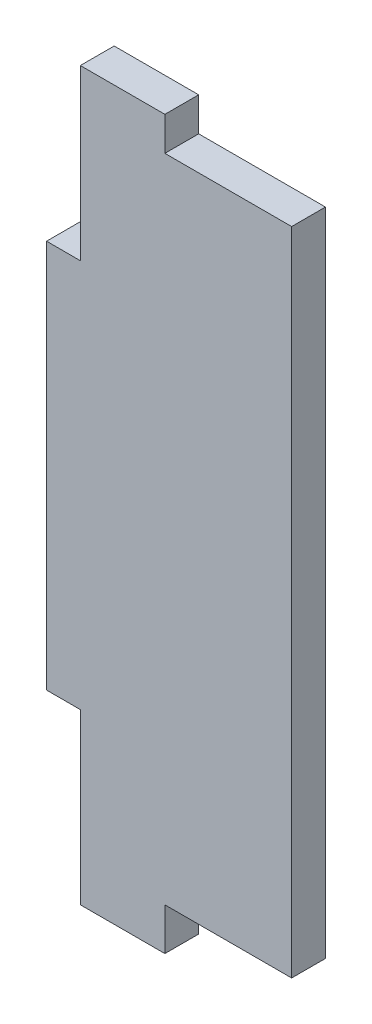
ISO-10303-21;
HEADER;
FILE_DESCRIPTION(('STEP AP214'),'2;1');
FILE_NAME('part.step','',(''),(''),'','','');
FILE_SCHEMA(('AUTOMOTIVE_DESIGN { 1 0 10303 214 1 1 1 1 }'));
ENDSEC;
DATA;
#1=APPLICATION_CONTEXT('core data for automotive mechanical design processes');
#2=APPLICATION_PROTOCOL_DEFINITION('international standard','automotive_design',2000,#1);
#3=PRODUCT_CONTEXT('',#1,'mechanical');
#4=PRODUCT('Part','Part','',(#3));
#5=PRODUCT_RELATED_PRODUCT_CATEGORY('part','',(#4));
#6=PRODUCT_DEFINITION_FORMATION('','',#4);
#7=PRODUCT_DEFINITION_CONTEXT('part definition',#1,'design');
#8=PRODUCT_DEFINITION('design','',#6,#7);
#9=PRODUCT_DEFINITION_SHAPE('','',#8);
#10=(LENGTH_UNIT() NAMED_UNIT(*) SI_UNIT(.MILLI.,.METRE.));
#11=(NAMED_UNIT(*) PLANE_ANGLE_UNIT() SI_UNIT($,.RADIAN.));
#12=(NAMED_UNIT(*) SI_UNIT($,.STERADIAN.) SOLID_ANGLE_UNIT());
#13=UNCERTAINTY_MEASURE_WITH_UNIT(LENGTH_MEASURE(1.E-05),#10,'distance_accuracy_value','');
#14=(GEOMETRIC_REPRESENTATION_CONTEXT(3) GLOBAL_UNCERTAINTY_ASSIGNED_CONTEXT((#13)) GLOBAL_UNIT_ASSIGNED_CONTEXT((#10,
#11,#12)) REPRESENTATION_CONTEXT('',''));
#15=CARTESIAN_POINT('',(0.,0.,0.));
#16=DIRECTION('',(0.,0.,1.));
#17=DIRECTION('',(1.,0.,0.));
#18=AXIS2_PLACEMENT_3D('',#15,#16,#17);
#19=CARTESIAN_POINT('',(0.,0.,4.));
#20=DIRECTION('',(1.,0.,0.));
#21=DIRECTION('',(0.,1.,0.));
#22=AXIS2_PLACEMENT_3D('',#19,#20,#21);
#23=PLANE('',#22);
#24=DIRECTION('',(0.,-1.,0.));
#25=VECTOR('',#24,1.);
#26=CARTESIAN_POINT('',(0.,0.,0.));
#27=LINE('',#26,#25);
#28=CARTESIAN_POINT('',(0.,20.,0.));
#29=VERTEX_POINT('',#28);
#30=CARTESIAN_POINT('',(0.,0.,0.));
#31=VERTEX_POINT('',#30);
#32=EDGE_CURVE('E152',#29,#31,#27,.T.);
#33=ORIENTED_EDGE('',*,*,#32,.T.);
#34=DIRECTION('',(0.,0.,-1.));
#35=VECTOR('',#34,1.);
#36=CARTESIAN_POINT('',(0.,0.,4.));
#37=LINE('',#36,#35);
#38=CARTESIAN_POINT('',(0.,0.,4.));
#39=VERTEX_POINT('',#38);
#40=EDGE_CURVE('E11',#39,#31,#37,.T.);
#41=ORIENTED_EDGE('',*,*,#40,.F.);
#42=DIRECTION('',(0.,-1.,0.));
#43=VECTOR('',#42,1.);
#44=CARTESIAN_POINT('',(0.,0.,4.));
#45=LINE('',#44,#43);
#46=CARTESIAN_POINT('',(0.,20.,4.));
#47=VERTEX_POINT('',#46);
#48=EDGE_CURVE('E174',#47,#39,#45,.T.);
#49=ORIENTED_EDGE('',*,*,#48,.F.);
#50=DIRECTION('',(0.,0.,-1.));
#51=VECTOR('',#50,1.);
#52=CARTESIAN_POINT('',(0.,20.,4.));
#53=LINE('',#52,#51);
#54=EDGE_CURVE('E148',#47,#29,#53,.T.);
#55=ORIENTED_EDGE('',*,*,#54,.T.);
#56=EDGE_LOOP('',(#33,#41,#49,#55));
#57=FACE_BOUND('',#56,.T.);
#58=ADVANCED_FACE('F32',(#57),#23,.F.);
#59=CARTESIAN_POINT('',(0.,0.,4.));
#60=DIRECTION('',(0.,1.,0.));
#61=DIRECTION('',(0.,0.,1.));
#62=AXIS2_PLACEMENT_3D('',#59,#60,#61);
#63=PLANE('',#62);
#64=DIRECTION('',(1.,0.,0.));
#65=VECTOR('',#64,1.);
#66=CARTESIAN_POINT('',(0.,0.,0.));
#67=LINE('',#66,#65);
#68=CARTESIAN_POINT('',(10.,0.,0.));
#69=VERTEX_POINT('',#68);
#70=EDGE_CURVE('E155',#31,#69,#67,.T.);
#71=ORIENTED_EDGE('',*,*,#70,.T.);
#72=DIRECTION('',(0.,0.,-1.));
#73=VECTOR('',#72,1.);
#74=CARTESIAN_POINT('',(10.,0.,4.));
#75=LINE('',#74,#73);
#76=CARTESIAN_POINT('',(10.,0.,4.));
#77=VERTEX_POINT('',#76);
#78=EDGE_CURVE('E40',#77,#69,#75,.T.);
#79=ORIENTED_EDGE('',*,*,#78,.F.);
#80=DIRECTION('',(1.,0.,0.));
#81=VECTOR('',#80,1.);
#82=CARTESIAN_POINT('',(0.,0.,4.));
#83=LINE('',#82,#81);
#84=EDGE_CURVE('E103',#39,#77,#83,.T.);
#85=ORIENTED_EDGE('',*,*,#84,.F.);
#86=ORIENTED_EDGE('',*,*,#40,.T.);
#87=EDGE_LOOP('',(#71,#79,#85,#86));
#88=FACE_BOUND('',#87,.T.);
#89=ADVANCED_FACE('F252',(#88),#63,.F.);
#90=CARTESIAN_POINT('',(10.,0.,4.));
#91=DIRECTION('',(-1.,0.,0.));
#92=DIRECTION('',(0.,0.,1.));
#93=AXIS2_PLACEMENT_3D('',#90,#91,#92);
#94=PLANE('',#93);
#95=DIRECTION('',(0.,1.,0.));
#96=VECTOR('',#95,1.);
#97=CARTESIAN_POINT('',(10.,0.,0.));
#98=LINE('',#97,#96);
#99=CARTESIAN_POINT('',(10.,5.,0.));
#100=VERTEX_POINT('',#99);
#101=EDGE_CURVE('E157',#69,#100,#98,.T.);
#102=ORIENTED_EDGE('',*,*,#101,.T.);
#103=DIRECTION('',(0.,0.,-1.));
#104=VECTOR('',#103,1.);
#105=CARTESIAN_POINT('',(10.,5.,4.));
#106=LINE('',#105,#104);
#107=CARTESIAN_POINT('',(10.,5.,4.));
#108=VERTEX_POINT('',#107);
#109=EDGE_CURVE('E193',#108,#100,#106,.T.);
#110=ORIENTED_EDGE('',*,*,#109,.F.);
#111=DIRECTION('',(0.,1.,0.));
#112=VECTOR('',#111,1.);
#113=CARTESIAN_POINT('',(10.,0.,4.));
#114=LINE('',#113,#112);
#115=EDGE_CURVE('E201',#77,#108,#114,.T.);
#116=ORIENTED_EDGE('',*,*,#115,.F.);
#117=ORIENTED_EDGE('',*,*,#78,.T.);
#118=EDGE_LOOP('',(#102,#110,#116,#117));
#119=FACE_BOUND('',#118,.T.);
#120=ADVANCED_FACE('F199',(#119),#94,.F.);
#121=CARTESIAN_POINT('',(10.,5.,4.));
#122=DIRECTION('',(0.,1.,0.));
#123=DIRECTION('',(0.,0.,1.));
#124=AXIS2_PLACEMENT_3D('',#121,#122,#123);
#125=PLANE('',#124);
#126=DIRECTION('',(1.,0.,0.));
#127=VECTOR('',#126,1.);
#128=CARTESIAN_POINT('',(10.,5.,0.));
#129=LINE('',#128,#127);
#130=CARTESIAN_POINT('',(25.,5.,0.));
#131=VERTEX_POINT('',#130);
#132=EDGE_CURVE('E159',#100,#131,#129,.T.);
#133=ORIENTED_EDGE('',*,*,#132,.T.);
#134=DIRECTION('',(0.,0.,-1.));
#135=VECTOR('',#134,1.);
#136=CARTESIAN_POINT('',(25.,5.,4.));
#137=LINE('',#136,#135);
#138=CARTESIAN_POINT('',(25.,5.,4.));
#139=VERTEX_POINT('',#138);
#140=EDGE_CURVE('E190',#139,#131,#137,.T.);
#141=ORIENTED_EDGE('',*,*,#140,.F.);
#142=DIRECTION('',(1.,0.,0.));
#143=VECTOR('',#142,1.);
#144=CARTESIAN_POINT('',(10.,5.,4.));
#145=LINE('',#144,#143);
#146=EDGE_CURVE('E219',#108,#139,#145,.T.);
#147=ORIENTED_EDGE('',*,*,#146,.F.);
#148=ORIENTED_EDGE('',*,*,#109,.T.);
#149=EDGE_LOOP('',(#133,#141,#147,#148));
#150=FACE_BOUND('',#149,.T.);
#151=ADVANCED_FACE('F210',(#150),#125,.F.);
#152=CARTESIAN_POINT('',(25.,5.,4.));
#153=DIRECTION('',(-1.,0.,0.));
#154=DIRECTION('',(0.,0.,1.));
#155=AXIS2_PLACEMENT_3D('',#152,#153,#154);
#156=PLANE('',#155);
#157=DIRECTION('',(0.,1.,0.));
#158=VECTOR('',#157,1.);
#159=CARTESIAN_POINT('',(25.,5.,0.));
#160=LINE('',#159,#158);
#161=CARTESIAN_POINT('',(25.,82.,0.));
#162=VERTEX_POINT('',#161);
#163=EDGE_CURVE('E161',#131,#162,#160,.T.);
#164=ORIENTED_EDGE('',*,*,#163,.T.);
#165=DIRECTION('',(0.,0.,-1.));
#166=VECTOR('',#165,1.);
#167=CARTESIAN_POINT('',(25.,82.,4.));
#168=LINE('',#167,#166);
#169=CARTESIAN_POINT('',(25.,82.,4.));
#170=VERTEX_POINT('',#169);
#171=EDGE_CURVE('E187',#170,#162,#168,.T.);
#172=ORIENTED_EDGE('',*,*,#171,.F.);
#173=DIRECTION('',(0.,1.,0.));
#174=VECTOR('',#173,1.);
#175=CARTESIAN_POINT('',(25.,5.,4.));
#176=LINE('',#175,#174);
#177=EDGE_CURVE('E216',#139,#170,#176,.T.);
#178=ORIENTED_EDGE('',*,*,#177,.F.);
#179=ORIENTED_EDGE('',*,*,#140,.T.);
#180=EDGE_LOOP('',(#164,#172,#178,#179));
#181=FACE_BOUND('',#180,.T.);
#182=ADVANCED_FACE('F214',(#181),#156,.F.);
#183=CARTESIAN_POINT('',(10.,82.,4.));
#184=DIRECTION('',(0.,-1.,0.));
#185=DIRECTION('',(0.,0.,-1.));
#186=AXIS2_PLACEMENT_3D('',#183,#184,#185);
#187=PLANE('',#186);
#188=DIRECTION('',(-1.,0.,0.));
#189=VECTOR('',#188,1.);
#190=CARTESIAN_POINT('',(10.,82.,0.));
#191=LINE('',#190,#189);
#192=CARTESIAN_POINT('',(10.,82.,0.));
#193=VERTEX_POINT('',#192);
#194=EDGE_CURVE('E163',#162,#193,#191,.T.);
#195=ORIENTED_EDGE('',*,*,#194,.T.);
#196=DIRECTION('',(0.,0.,-1.));
#197=VECTOR('',#196,1.);
#198=CARTESIAN_POINT('',(10.,82.,4.));
#199=LINE('',#198,#197);
#200=CARTESIAN_POINT('',(10.,82.,4.));
#201=VERTEX_POINT('',#200);
#202=EDGE_CURVE('E184',#201,#193,#199,.T.);
#203=ORIENTED_EDGE('',*,*,#202,.F.);
#204=DIRECTION('',(-1.,0.,0.));
#205=VECTOR('',#204,1.);
#206=CARTESIAN_POINT('',(10.,82.,4.));
#207=LINE('',#206,#205);
#208=EDGE_CURVE('E218',#170,#201,#207,.T.);
#209=ORIENTED_EDGE('',*,*,#208,.F.);
#210=ORIENTED_EDGE('',*,*,#171,.T.);
#211=EDGE_LOOP('',(#195,#203,#209,#210));
#212=FACE_BOUND('',#211,.T.);
#213=ADVANCED_FACE('F265',(#212),#187,.F.);
#214=CARTESIAN_POINT('',(10.,86.,4.));
#215=DIRECTION('',(-1.,0.,0.));
#216=DIRECTION('',(0.,0.,1.));
#217=AXIS2_PLACEMENT_3D('',#214,#215,#216);
#218=PLANE('',#217);
#219=DIRECTION('',(0.,1.,0.));
#220=VECTOR('',#219,1.);
#221=CARTESIAN_POINT('',(10.,86.,0.));
#222=LINE('',#221,#220);
#223=CARTESIAN_POINT('',(10.,86.,0.));
#224=VERTEX_POINT('',#223);
#225=EDGE_CURVE('E165',#193,#224,#222,.T.);
#226=ORIENTED_EDGE('',*,*,#225,.T.);
#227=DIRECTION('',(0.,0.,-1.));
#228=VECTOR('',#227,1.);
#229=CARTESIAN_POINT('',(10.,86.,4.));
#230=LINE('',#229,#228);
#231=CARTESIAN_POINT('',(10.,86.,4.));
#232=VERTEX_POINT('',#231);
#233=EDGE_CURVE('E181',#232,#224,#230,.T.);
#234=ORIENTED_EDGE('',*,*,#233,.F.);
#235=DIRECTION('',(0.,1.,0.));
#236=VECTOR('',#235,1.);
#237=CARTESIAN_POINT('',(10.,86.,4.));
#238=LINE('',#237,#236);
#239=EDGE_CURVE('E221',#201,#232,#238,.T.);
#240=ORIENTED_EDGE('',*,*,#239,.F.);
#241=ORIENTED_EDGE('',*,*,#202,.T.);
#242=EDGE_LOOP('',(#226,#234,#240,#241));
#243=FACE_BOUND('',#242,.T.);
#244=ADVANCED_FACE('F268',(#243),#218,.F.);
#245=CARTESIAN_POINT('',(0.,86.,4.));
#246=DIRECTION('',(0.,-1.,0.));
#247=DIRECTION('',(0.,0.,-1.));
#248=AXIS2_PLACEMENT_3D('',#245,#246,#247);
#249=PLANE('',#248);
#250=DIRECTION('',(-1.,0.,0.));
#251=VECTOR('',#250,1.);
#252=CARTESIAN_POINT('',(0.,86.,0.));
#253=LINE('',#252,#251);
#254=CARTESIAN_POINT('',(0.,86.,0.));
#255=VERTEX_POINT('',#254);
#256=EDGE_CURVE('E167',#224,#255,#253,.T.);
#257=ORIENTED_EDGE('',*,*,#256,.T.);
#258=DIRECTION('',(0.,0.,-1.));
#259=VECTOR('',#258,1.);
#260=CARTESIAN_POINT('',(0.,86.,4.));
#261=LINE('',#260,#259);
#262=CARTESIAN_POINT('',(0.,86.,4.));
#263=VERTEX_POINT('',#262);
#264=EDGE_CURVE('E178',#263,#255,#261,.T.);
#265=ORIENTED_EDGE('',*,*,#264,.F.);
#266=DIRECTION('',(-1.,0.,0.));
#267=VECTOR('',#266,1.);
#268=CARTESIAN_POINT('',(0.,86.,4.));
#269=LINE('',#268,#267);
#270=EDGE_CURVE('E227',#232,#263,#269,.T.);
#271=ORIENTED_EDGE('',*,*,#270,.F.);
#272=ORIENTED_EDGE('',*,*,#233,.T.);
#273=EDGE_LOOP('',(#257,#265,#271,#272));
#274=FACE_BOUND('',#273,.T.);
#275=ADVANCED_FACE('F233',(#274),#249,.F.);
#276=CARTESIAN_POINT('',(0.,66.,4.));
#277=DIRECTION('',(1.,0.,0.));
#278=DIRECTION('',(0.,0.,-1.));
#279=AXIS2_PLACEMENT_3D('',#276,#277,#278);
#280=PLANE('',#279);
#281=DIRECTION('',(0.,-1.,0.));
#282=VECTOR('',#281,1.);
#283=CARTESIAN_POINT('',(0.,66.,0.));
#284=LINE('',#283,#282);
#285=CARTESIAN_POINT('',(0.,66.,0.));
#286=VERTEX_POINT('',#285);
#287=EDGE_CURVE('E169',#255,#286,#284,.T.);
#288=ORIENTED_EDGE('',*,*,#287,.T.);
#289=DIRECTION('',(0.,0.,-1.));
#290=VECTOR('',#289,1.);
#291=CARTESIAN_POINT('',(0.,66.,4.));
#292=LINE('',#291,#290);
#293=CARTESIAN_POINT('',(0.,66.,4.));
#294=VERTEX_POINT('',#293);
#295=EDGE_CURVE('E143',#294,#286,#292,.T.);
#296=ORIENTED_EDGE('',*,*,#295,.F.);
#297=DIRECTION('',(0.,-1.,0.));
#298=VECTOR('',#297,1.);
#299=CARTESIAN_POINT('',(0.,66.,4.));
#300=LINE('',#299,#298);
#301=EDGE_CURVE('E134',#263,#294,#300,.T.);
#302=ORIENTED_EDGE('',*,*,#301,.F.);
#303=ORIENTED_EDGE('',*,*,#264,.T.);
#304=EDGE_LOOP('',(#288,#296,#302,#303));
#305=FACE_BOUND('',#304,.T.);
#306=ADVANCED_FACE('F237',(#305),#280,.F.);
#307=CARTESIAN_POINT('',(0.,66.,4.));
#308=DIRECTION('',(0.,-1.,0.));
#309=DIRECTION('',(0.,0.,-1.));
#310=AXIS2_PLACEMENT_3D('',#307,#308,#309);
#311=PLANE('',#310);
#312=DIRECTION('',(-1.,0.,0.));
#313=VECTOR('',#312,1.);
#314=CARTESIAN_POINT('',(0.,66.,0.));
#315=LINE('',#314,#313);
#316=CARTESIAN_POINT('',(-4.,66.,0.));
#317=VERTEX_POINT('',#316);
#318=EDGE_CURVE('E142',#286,#317,#315,.T.);
#319=ORIENTED_EDGE('',*,*,#318,.T.);
#320=DIRECTION('',(0.,0.,-1.));
#321=VECTOR('',#320,1.);
#322=CARTESIAN_POINT('',(-4.,66.,4.));
#323=LINE('',#322,#321);
#324=CARTESIAN_POINT('',(-4.,66.,4.));
#325=VERTEX_POINT('',#324);
#326=EDGE_CURVE('E139',#325,#317,#323,.T.);
#327=ORIENTED_EDGE('',*,*,#326,.F.);
#328=DIRECTION('',(-1.,0.,0.));
#329=VECTOR('',#328,1.);
#330=CARTESIAN_POINT('',(0.,66.,4.));
#331=LINE('',#330,#329);
#332=EDGE_CURVE('E128',#294,#325,#331,.T.);
#333=ORIENTED_EDGE('',*,*,#332,.F.);
#334=ORIENTED_EDGE('',*,*,#295,.T.);
#335=EDGE_LOOP('',(#319,#327,#333,#334));
#336=FACE_BOUND('',#335,.T.);
#337=ADVANCED_FACE('F140',(#336),#311,.F.);
#338=CARTESIAN_POINT('',(-4.,66.,4.));
#339=DIRECTION('',(1.,0.,0.));
#340=DIRECTION('',(0.,1.,0.));
#341=AXIS2_PLACEMENT_3D('',#338,#339,#340);
#342=PLANE('',#341);
#343=DIRECTION('',(0.,-1.,0.));
#344=VECTOR('',#343,1.);
#345=CARTESIAN_POINT('',(-4.,66.,0.));
#346=LINE('',#345,#344);
#347=CARTESIAN_POINT('',(-4.00000000000001,20.,0.));
#348=VERTEX_POINT('',#347);
#349=EDGE_CURVE('E89',#317,#348,#346,.T.);
#350=ORIENTED_EDGE('',*,*,#349,.T.);
#351=DIRECTION('',(0.,0.,-1.));
#352=VECTOR('',#351,1.);
#353=CARTESIAN_POINT('',(-4.00000000000001,20.,4.));
#354=LINE('',#353,#352);
#355=CARTESIAN_POINT('',(-4.00000000000001,20.,4.));
#356=VERTEX_POINT('',#355);
#357=EDGE_CURVE('E144',#356,#348,#354,.T.);
#358=ORIENTED_EDGE('',*,*,#357,.F.);
#359=DIRECTION('',(0.,-1.,0.));
#360=VECTOR('',#359,1.);
#361=CARTESIAN_POINT('',(-4.,66.,4.));
#362=LINE('',#361,#360);
#363=EDGE_CURVE('E132',#325,#356,#362,.T.);
#364=ORIENTED_EDGE('',*,*,#363,.F.);
#365=ORIENTED_EDGE('',*,*,#326,.T.);
#366=EDGE_LOOP('',(#350,#358,#364,#365));
#367=FACE_BOUND('',#366,.T.);
#368=ADVANCED_FACE('F146',(#367),#342,.F.);
#369=CARTESIAN_POINT('',(0.,20.,4.));
#370=DIRECTION('',(0.,1.,0.));
#371=DIRECTION('',(0.,0.,1.));
#372=AXIS2_PLACEMENT_3D('',#369,#370,#371);
#373=PLANE('',#372);
#374=DIRECTION('',(1.,0.,0.));
#375=VECTOR('',#374,1.);
#376=CARTESIAN_POINT('',(0.,20.,0.));
#377=LINE('',#376,#375);
#378=EDGE_CURVE('E95',#348,#29,#377,.T.);
#379=ORIENTED_EDGE('',*,*,#378,.T.);
#380=ORIENTED_EDGE('',*,*,#54,.F.);
#381=DIRECTION('',(1.,0.,0.));
#382=VECTOR('',#381,1.);
#383=CARTESIAN_POINT('',(0.,20.,4.));
#384=LINE('',#383,#382);
#385=EDGE_CURVE('E48',#356,#47,#384,.T.);
#386=ORIENTED_EDGE('',*,*,#385,.F.);
#387=ORIENTED_EDGE('',*,*,#357,.T.);
#388=EDGE_LOOP('',(#379,#380,#386,#387));
#389=FACE_BOUND('',#388,.T.);
#390=ADVANCED_FACE('F241',(#389),#373,.F.);
#391=CARTESIAN_POINT('',(0.,0.,4.));
#392=DIRECTION('',(0.,0.,1.));
#393=DIRECTION('',(1.,0.,0.));
#394=AXIS2_PLACEMENT_3D('',#391,#392,#393);
#395=PLANE('',#394);
#396=ORIENTED_EDGE('',*,*,#48,.T.);
#397=ORIENTED_EDGE('',*,*,#84,.T.);
#398=ORIENTED_EDGE('',*,*,#115,.T.);
#399=ORIENTED_EDGE('',*,*,#146,.T.);
#400=ORIENTED_EDGE('',*,*,#177,.T.);
#401=ORIENTED_EDGE('',*,*,#208,.T.);
#402=ORIENTED_EDGE('',*,*,#239,.T.);
#403=ORIENTED_EDGE('',*,*,#270,.T.);
#404=ORIENTED_EDGE('',*,*,#301,.T.);
#405=ORIENTED_EDGE('',*,*,#332,.T.);
#406=ORIENTED_EDGE('',*,*,#363,.T.);
#407=ORIENTED_EDGE('',*,*,#385,.T.);
#408=EDGE_LOOP('',(#396,#397,#398,#399,#400,#401,#402,#403,#404,#405,#406,#407));
#409=FACE_BOUND('',#408,.T.);
#410=ADVANCED_FACE('F130',(#409),#395,.T.);
#411=CARTESIAN_POINT('',(0.,0.,0.));
#412=DIRECTION('',(0.,0.,1.));
#413=DIRECTION('',(1.,0.,0.));
#414=AXIS2_PLACEMENT_3D('',#411,#412,#413);
#415=PLANE('',#414);
#416=ORIENTED_EDGE('',*,*,#32,.F.);
#417=ORIENTED_EDGE('',*,*,#378,.F.);
#418=ORIENTED_EDGE('',*,*,#349,.F.);
#419=ORIENTED_EDGE('',*,*,#318,.F.);
#420=ORIENTED_EDGE('',*,*,#287,.F.);
#421=ORIENTED_EDGE('',*,*,#256,.F.);
#422=ORIENTED_EDGE('',*,*,#225,.F.);
#423=ORIENTED_EDGE('',*,*,#194,.F.);
#424=ORIENTED_EDGE('',*,*,#163,.F.);
#425=ORIENTED_EDGE('',*,*,#132,.F.);
#426=ORIENTED_EDGE('',*,*,#101,.F.);
#427=ORIENTED_EDGE('',*,*,#70,.F.);
#428=EDGE_LOOP('',(#416,#417,#418,#419,#420,#421,#422,#423,#424,#425,#426,#427));
#429=FACE_BOUND('',#428,.T.);
#430=ADVANCED_FACE('F205',(#429),#415,.F.);
#431=CLOSED_SHELL('',(#58,#89,#120,#151,#182,#213,#244,#275,#306,#337,#368,#390,#410,#430));
#432=MANIFOLD_SOLID_BREP('B2',#431);
#433=ADVANCED_BREP_SHAPE_REPRESENTATION('',(#18,#432),#14);
#434=SHAPE_DEFINITION_REPRESENTATION(#9,#433);
ENDSEC;
END-ISO-10303-21;
